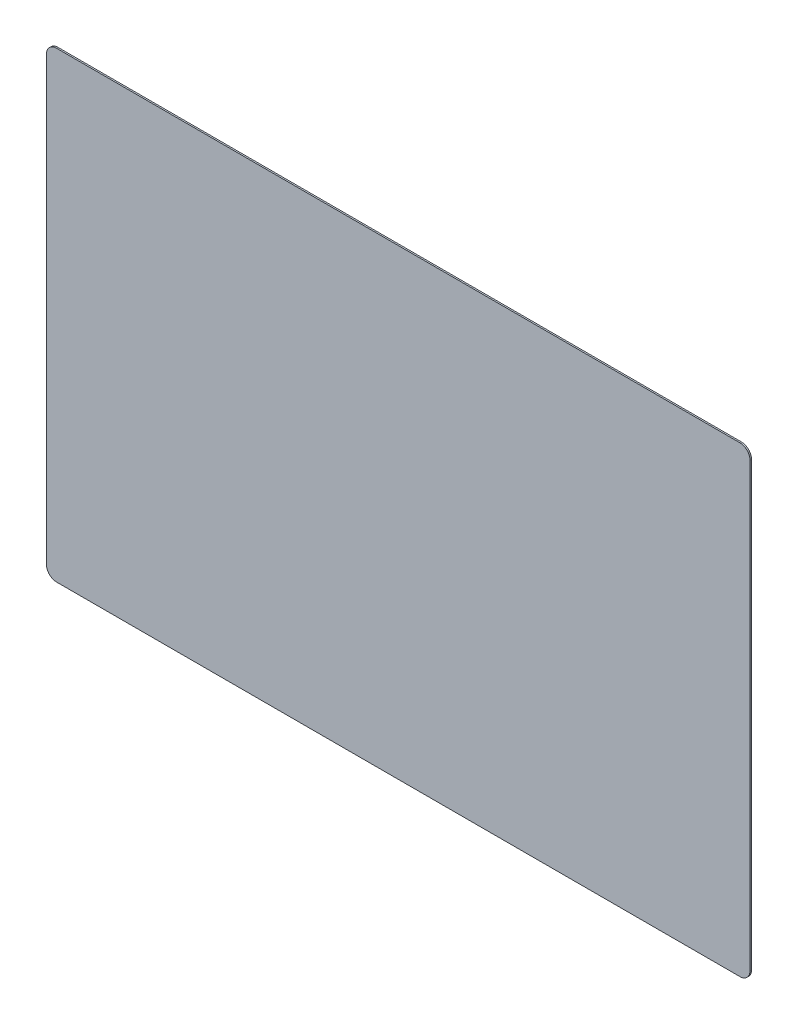
ISO-10303-21;
HEADER;
FILE_DESCRIPTION(('STEP AP214'),'2;1');
FILE_NAME('part.step','',(''),(''),'','','');
FILE_SCHEMA(('AUTOMOTIVE_DESIGN { 1 0 10303 214 1 1 1 1 }'));
ENDSEC;
DATA;
#1=APPLICATION_CONTEXT('core data for automotive mechanical design processes');
#2=APPLICATION_PROTOCOL_DEFINITION('international standard','automotive_design',2000,#1);
#3=PRODUCT_CONTEXT('',#1,'mechanical');
#4=PRODUCT('Part','Part','',(#3));
#5=PRODUCT_RELATED_PRODUCT_CATEGORY('part','',(#4));
#6=PRODUCT_DEFINITION_FORMATION('','',#4);
#7=PRODUCT_DEFINITION_CONTEXT('part definition',#1,'design');
#8=PRODUCT_DEFINITION('design','',#6,#7);
#9=PRODUCT_DEFINITION_SHAPE('','',#8);
#10=(LENGTH_UNIT() NAMED_UNIT(*) SI_UNIT(.MILLI.,.METRE.));
#11=(NAMED_UNIT(*) PLANE_ANGLE_UNIT() SI_UNIT($,.RADIAN.));
#12=(NAMED_UNIT(*) SI_UNIT($,.STERADIAN.) SOLID_ANGLE_UNIT());
#13=UNCERTAINTY_MEASURE_WITH_UNIT(LENGTH_MEASURE(1.E-05),#10,'distance_accuracy_value','');
#14=(GEOMETRIC_REPRESENTATION_CONTEXT(3) GLOBAL_UNCERTAINTY_ASSIGNED_CONTEXT((#13)) GLOBAL_UNIT_ASSIGNED_CONTEXT((#10,
#11,#12)) REPRESENTATION_CONTEXT('',''));
#15=CARTESIAN_POINT('',(0.,0.,0.));
#16=DIRECTION('',(0.,0.,1.));
#17=DIRECTION('',(1.,0.,0.));
#18=AXIS2_PLACEMENT_3D('',#15,#16,#17);
#19=CARTESIAN_POINT('',(-350.,-230.,-1.5));
#20=DIRECTION('',(-1.,0.,0.));
#21=DIRECTION('',(0.,0.,1.));
#22=AXIS2_PLACEMENT_3D('',#19,#20,#21);
#23=PLANE('',#22);
#24=DIRECTION('',(0.,-1.,0.));
#25=VECTOR('',#24,1.);
#26=CARTESIAN_POINT('',(-350.,-230.,0.));
#27=LINE('',#26,#25);
#28=CARTESIAN_POINT('',(-350.,220.,0.));
#29=VERTEX_POINT('',#28);
#30=CARTESIAN_POINT('',(-350.,-220.,0.));
#31=VERTEX_POINT('',#30);
#32=EDGE_CURVE('E111',#29,#31,#27,.T.);
#33=ORIENTED_EDGE('',*,*,#32,.F.);
#34=DIRECTION('',(0.,0.,1.));
#35=VECTOR('',#34,1.);
#36=CARTESIAN_POINT('',(-350.,220.,-1.5));
#37=LINE('',#36,#35);
#38=CARTESIAN_POINT('',(-350.,220.,-1.5));
#39=VERTEX_POINT('',#38);
#40=EDGE_CURVE('E11',#29,#39,#37,.F.);
#41=ORIENTED_EDGE('',*,*,#40,.T.);
#42=DIRECTION('',(0.,-1.,0.));
#43=VECTOR('',#42,1.);
#44=CARTESIAN_POINT('',(-350.,-230.,-1.5));
#45=LINE('',#44,#43);
#46=CARTESIAN_POINT('',(-350.,-220.,-1.5));
#47=VERTEX_POINT('',#46);
#48=EDGE_CURVE('E161',#39,#47,#45,.T.);
#49=ORIENTED_EDGE('',*,*,#48,.T.);
#50=DIRECTION('',(0.,0.,1.));
#51=VECTOR('',#50,1.);
#52=CARTESIAN_POINT('',(-350.,-220.,-1.5));
#53=LINE('',#52,#51);
#54=EDGE_CURVE('E48',#47,#31,#53,.T.);
#55=ORIENTED_EDGE('',*,*,#54,.T.);
#56=EDGE_LOOP('',(#33,#41,#49,#55));
#57=FACE_BOUND('',#56,.T.);
#58=ADVANCED_FACE('F40',(#57),#23,.T.);
#59=CARTESIAN_POINT('',(350.,230.,-1.5));
#60=DIRECTION('',(0.,1.,0.));
#61=DIRECTION('',(-1.,0.,0.));
#62=AXIS2_PLACEMENT_3D('',#59,#60,#61);
#63=PLANE('',#62);
#64=DIRECTION('',(-1.,0.,0.));
#65=VECTOR('',#64,1.);
#66=CARTESIAN_POINT('',(350.,230.,0.));
#67=LINE('',#66,#65);
#68=CARTESIAN_POINT('',(340.,230.,0.));
#69=VERTEX_POINT('',#68);
#70=CARTESIAN_POINT('',(-340.,230.,0.));
#71=VERTEX_POINT('',#70);
#72=EDGE_CURVE('E136',#69,#71,#67,.T.);
#73=ORIENTED_EDGE('',*,*,#72,.F.);
#74=DIRECTION('',(0.,0.,1.));
#75=VECTOR('',#74,1.);
#76=CARTESIAN_POINT('',(340.,230.,-1.5));
#77=LINE('',#76,#75);
#78=CARTESIAN_POINT('',(340.,230.,-1.5));
#79=VERTEX_POINT('',#78);
#80=EDGE_CURVE('E62',#69,#79,#77,.F.);
#81=ORIENTED_EDGE('',*,*,#80,.T.);
#82=DIRECTION('',(-1.,0.,0.));
#83=VECTOR('',#82,1.);
#84=CARTESIAN_POINT('',(350.,230.,-1.5));
#85=LINE('',#84,#83);
#86=CARTESIAN_POINT('',(-340.,230.,-1.5));
#87=VERTEX_POINT('',#86);
#88=EDGE_CURVE('E130',#79,#87,#85,.T.);
#89=ORIENTED_EDGE('',*,*,#88,.T.);
#90=DIRECTION('',(0.,0.,1.));
#91=VECTOR('',#90,1.);
#92=CARTESIAN_POINT('',(-340.,230.,-1.5));
#93=LINE('',#92,#91);
#94=EDGE_CURVE('E155',#87,#71,#93,.T.);
#95=ORIENTED_EDGE('',*,*,#94,.T.);
#96=EDGE_LOOP('',(#73,#81,#89,#95));
#97=FACE_BOUND('',#96,.T.);
#98=ADVANCED_FACE('F193',(#97),#63,.T.);
#99=CARTESIAN_POINT('',(350.,-230.,-1.5));
#100=DIRECTION('',(1.,0.,0.));
#101=DIRECTION('',(0.,0.,-1.));
#102=AXIS2_PLACEMENT_3D('',#99,#100,#101);
#103=PLANE('',#102);
#104=DIRECTION('',(0.,1.,0.));
#105=VECTOR('',#104,1.);
#106=CARTESIAN_POINT('',(350.,-230.,0.));
#107=LINE('',#106,#105);
#108=CARTESIAN_POINT('',(350.,-220.,0.));
#109=VERTEX_POINT('',#108);
#110=CARTESIAN_POINT('',(350.,220.,0.));
#111=VERTEX_POINT('',#110);
#112=EDGE_CURVE('E126',#109,#111,#107,.T.);
#113=ORIENTED_EDGE('',*,*,#112,.F.);
#114=DIRECTION('',(0.,0.,1.));
#115=VECTOR('',#114,1.);
#116=CARTESIAN_POINT('',(350.,-220.,-1.5));
#117=LINE('',#116,#115);
#118=CARTESIAN_POINT('',(350.,-220.,-1.5));
#119=VERTEX_POINT('',#118);
#120=EDGE_CURVE('E147',#109,#119,#117,.F.);
#121=ORIENTED_EDGE('',*,*,#120,.T.);
#122=DIRECTION('',(0.,1.,0.));
#123=VECTOR('',#122,1.);
#124=CARTESIAN_POINT('',(350.,-230.,-1.5));
#125=LINE('',#124,#123);
#126=CARTESIAN_POINT('',(350.,220.,-1.5));
#127=VERTEX_POINT('',#126);
#128=EDGE_CURVE('E133',#119,#127,#125,.T.);
#129=ORIENTED_EDGE('',*,*,#128,.T.);
#130=DIRECTION('',(0.,0.,1.));
#131=VECTOR('',#130,1.);
#132=CARTESIAN_POINT('',(350.,220.,-1.5));
#133=LINE('',#132,#131);
#134=EDGE_CURVE('E144',#127,#111,#133,.T.);
#135=ORIENTED_EDGE('',*,*,#134,.T.);
#136=EDGE_LOOP('',(#113,#121,#129,#135));
#137=FACE_BOUND('',#136,.T.);
#138=ADVANCED_FACE('F173',(#137),#103,.T.);
#139=CARTESIAN_POINT('',(350.,-230.,-1.5));
#140=DIRECTION('',(0.,-1.,0.));
#141=DIRECTION('',(1.,0.,0.));
#142=AXIS2_PLACEMENT_3D('',#139,#140,#141);
#143=PLANE('',#142);
#144=DIRECTION('',(1.,0.,0.));
#145=VECTOR('',#144,1.);
#146=CARTESIAN_POINT('',(350.,-230.,-1.5));
#147=LINE('',#146,#145);
#148=CARTESIAN_POINT('',(-340.,-230.,-1.5));
#149=VERTEX_POINT('',#148);
#150=CARTESIAN_POINT('',(340.,-230.,-1.5));
#151=VERTEX_POINT('',#150);
#152=EDGE_CURVE('E162',#149,#151,#147,.T.);
#153=ORIENTED_EDGE('',*,*,#152,.T.);
#154=DIRECTION('',(0.,0.,1.));
#155=VECTOR('',#154,1.);
#156=CARTESIAN_POINT('',(340.,-230.,-1.5));
#157=LINE('',#156,#155);
#158=CARTESIAN_POINT('',(340.,-230.,0.));
#159=VERTEX_POINT('',#158);
#160=EDGE_CURVE('E117',#151,#159,#157,.T.);
#161=ORIENTED_EDGE('',*,*,#160,.T.);
#162=DIRECTION('',(1.,0.,0.));
#163=VECTOR('',#162,1.);
#164=CARTESIAN_POINT('',(350.,-230.,0.));
#165=LINE('',#164,#163);
#166=CARTESIAN_POINT('',(-340.,-230.,0.));
#167=VERTEX_POINT('',#166);
#168=EDGE_CURVE('E109',#167,#159,#165,.T.);
#169=ORIENTED_EDGE('',*,*,#168,.F.);
#170=DIRECTION('',(0.,0.,1.));
#171=VECTOR('',#170,1.);
#172=CARTESIAN_POINT('',(-340.,-230.,-1.5));
#173=LINE('',#172,#171);
#174=EDGE_CURVE('E123',#167,#149,#173,.F.);
#175=ORIENTED_EDGE('',*,*,#174,.T.);
#176=EDGE_LOOP('',(#153,#161,#169,#175));
#177=FACE_BOUND('',#176,.T.);
#178=ADVANCED_FACE('F122',(#177),#143,.T.);
#179=CARTESIAN_POINT('',(0.,0.,-1.5));
#180=DIRECTION('',(0.,0.,1.));
#181=DIRECTION('',(1.,0.,0.));
#182=AXIS2_PLACEMENT_3D('',#179,#180,#181);
#183=PLANE('',#182);
#184=ORIENTED_EDGE('',*,*,#128,.F.);
#185=CARTESIAN_POINT('',(340.,-220.,-1.5));
#186=DIRECTION('',(0.,0.,1.));
#187=DIRECTION('',(1.,0.,0.));
#188=AXIS2_PLACEMENT_3D('',#185,#186,#187);
#189=CIRCLE('',#188,10.);
#190=EDGE_CURVE('E153',#119,#151,#189,.F.);
#191=ORIENTED_EDGE('',*,*,#190,.T.);
#192=ORIENTED_EDGE('',*,*,#152,.F.);
#193=CARTESIAN_POINT('',(-340.,-220.,-1.5));
#194=DIRECTION('',(0.,0.,1.));
#195=DIRECTION('',(1.,0.,0.));
#196=AXIS2_PLACEMENT_3D('',#193,#194,#195);
#197=CIRCLE('',#196,10.);
#198=EDGE_CURVE('E129',#149,#47,#197,.F.);
#199=ORIENTED_EDGE('',*,*,#198,.T.);
#200=ORIENTED_EDGE('',*,*,#48,.F.);
#201=CARTESIAN_POINT('',(-340.,220.,-1.5));
#202=DIRECTION('',(0.,0.,1.));
#203=DIRECTION('',(1.,0.,0.));
#204=AXIS2_PLACEMENT_3D('',#201,#202,#203);
#205=CIRCLE('',#204,10.);
#206=EDGE_CURVE('E55',#39,#87,#205,.F.);
#207=ORIENTED_EDGE('',*,*,#206,.T.);
#208=ORIENTED_EDGE('',*,*,#88,.F.);
#209=CARTESIAN_POINT('',(340.,220.,-1.5));
#210=DIRECTION('',(0.,0.,1.));
#211=DIRECTION('',(1.,0.,0.));
#212=AXIS2_PLACEMENT_3D('',#209,#210,#211);
#213=CIRCLE('',#212,10.);
#214=EDGE_CURVE('E151',#79,#127,#213,.F.);
#215=ORIENTED_EDGE('',*,*,#214,.T.);
#216=EDGE_LOOP('',(#184,#191,#192,#199,#200,#207,#208,#215));
#217=FACE_BOUND('',#216,.T.);
#218=ADVANCED_FACE('F179',(#217),#183,.F.);
#219=CARTESIAN_POINT('',(0.,0.,0.));
#220=DIRECTION('',(0.,0.,1.));
#221=DIRECTION('',(1.,0.,0.));
#222=AXIS2_PLACEMENT_3D('',#219,#220,#221);
#223=PLANE('',#222);
#224=ORIENTED_EDGE('',*,*,#168,.T.);
#225=CARTESIAN_POINT('',(340.,-220.,0.));
#226=DIRECTION('',(0.,0.,1.));
#227=DIRECTION('',(1.,0.,0.));
#228=AXIS2_PLACEMENT_3D('',#225,#226,#227);
#229=CIRCLE('',#228,10.);
#230=EDGE_CURVE('E142',#159,#109,#229,.T.);
#231=ORIENTED_EDGE('',*,*,#230,.T.);
#232=ORIENTED_EDGE('',*,*,#112,.T.);
#233=CARTESIAN_POINT('',(340.,220.,0.));
#234=DIRECTION('',(0.,0.,1.));
#235=DIRECTION('',(1.,0.,0.));
#236=AXIS2_PLACEMENT_3D('',#233,#234,#235);
#237=CIRCLE('',#236,10.);
#238=EDGE_CURVE('E140',#111,#69,#237,.T.);
#239=ORIENTED_EDGE('',*,*,#238,.T.);
#240=ORIENTED_EDGE('',*,*,#72,.T.);
#241=CARTESIAN_POINT('',(-340.,220.,0.));
#242=DIRECTION('',(0.,0.,1.));
#243=DIRECTION('',(1.,0.,0.));
#244=AXIS2_PLACEMENT_3D('',#241,#242,#243);
#245=CIRCLE('',#244,10.);
#246=EDGE_CURVE('E116',#71,#29,#245,.T.);
#247=ORIENTED_EDGE('',*,*,#246,.T.);
#248=ORIENTED_EDGE('',*,*,#32,.T.);
#249=CARTESIAN_POINT('',(-340.,-220.,0.));
#250=DIRECTION('',(0.,0.,1.));
#251=DIRECTION('',(1.,0.,0.));
#252=AXIS2_PLACEMENT_3D('',#249,#250,#251);
#253=CIRCLE('',#252,10.);
#254=EDGE_CURVE('E106',#31,#167,#253,.T.);
#255=ORIENTED_EDGE('',*,*,#254,.T.);
#256=EDGE_LOOP('',(#224,#231,#232,#239,#240,#247,#248,#255));
#257=FACE_BOUND('',#256,.T.);
#258=ADVANCED_FACE('F108',(#257),#223,.T.);
#259=CARTESIAN_POINT('',(340.,-220.,-1.5));
#260=DIRECTION('',(0.,0.,1.));
#261=DIRECTION('',(1.,0.,0.));
#262=AXIS2_PLACEMENT_3D('',#259,#260,#261);
#263=CYLINDRICAL_SURFACE('',#262,10.);
#264=ORIENTED_EDGE('',*,*,#190,.F.);
#265=ORIENTED_EDGE('',*,*,#120,.F.);
#266=ORIENTED_EDGE('',*,*,#230,.F.);
#267=ORIENTED_EDGE('',*,*,#160,.F.);
#268=EDGE_LOOP('',(#264,#265,#266,#267));
#269=FACE_BOUND('',#268,.T.);
#270=ADVANCED_FACE('F178',(#269),#263,.T.);
#271=CARTESIAN_POINT('',(340.,220.,-1.5));
#272=DIRECTION('',(0.,0.,1.));
#273=DIRECTION('',(1.,0.,0.));
#274=AXIS2_PLACEMENT_3D('',#271,#272,#273);
#275=CYLINDRICAL_SURFACE('',#274,10.);
#276=ORIENTED_EDGE('',*,*,#214,.F.);
#277=ORIENTED_EDGE('',*,*,#80,.F.);
#278=ORIENTED_EDGE('',*,*,#238,.F.);
#279=ORIENTED_EDGE('',*,*,#134,.F.);
#280=EDGE_LOOP('',(#276,#277,#278,#279));
#281=FACE_BOUND('',#280,.T.);
#282=ADVANCED_FACE('F182',(#281),#275,.T.);
#283=CARTESIAN_POINT('',(-340.,220.,-1.5));
#284=DIRECTION('',(0.,0.,1.));
#285=DIRECTION('',(1.,0.,0.));
#286=AXIS2_PLACEMENT_3D('',#283,#284,#285);
#287=CYLINDRICAL_SURFACE('',#286,10.);
#288=ORIENTED_EDGE('',*,*,#206,.F.);
#289=ORIENTED_EDGE('',*,*,#40,.F.);
#290=ORIENTED_EDGE('',*,*,#246,.F.);
#291=ORIENTED_EDGE('',*,*,#94,.F.);
#292=EDGE_LOOP('',(#288,#289,#290,#291));
#293=FACE_BOUND('',#292,.T.);
#294=ADVANCED_FACE('F184',(#293),#287,.T.);
#295=CARTESIAN_POINT('',(-340.,-220.,-1.5));
#296=DIRECTION('',(0.,0.,1.));
#297=DIRECTION('',(1.,0.,0.));
#298=AXIS2_PLACEMENT_3D('',#295,#296,#297);
#299=CYLINDRICAL_SURFACE('',#298,10.);
#300=ORIENTED_EDGE('',*,*,#198,.F.);
#301=ORIENTED_EDGE('',*,*,#174,.F.);
#302=ORIENTED_EDGE('',*,*,#254,.F.);
#303=ORIENTED_EDGE('',*,*,#54,.F.);
#304=EDGE_LOOP('',(#300,#301,#302,#303));
#305=FACE_BOUND('',#304,.T.);
#306=ADVANCED_FACE('F42',(#305),#299,.T.);
#307=CLOSED_SHELL('',(#58,#98,#138,#178,#218,#258,#270,#282,#294,#306));
#308=MANIFOLD_SOLID_BREP('B2',#307);
#309=ADVANCED_BREP_SHAPE_REPRESENTATION('',(#18,#308),#14);
#310=SHAPE_DEFINITION_REPRESENTATION(#9,#309);
ENDSEC;
END-ISO-10303-21;
